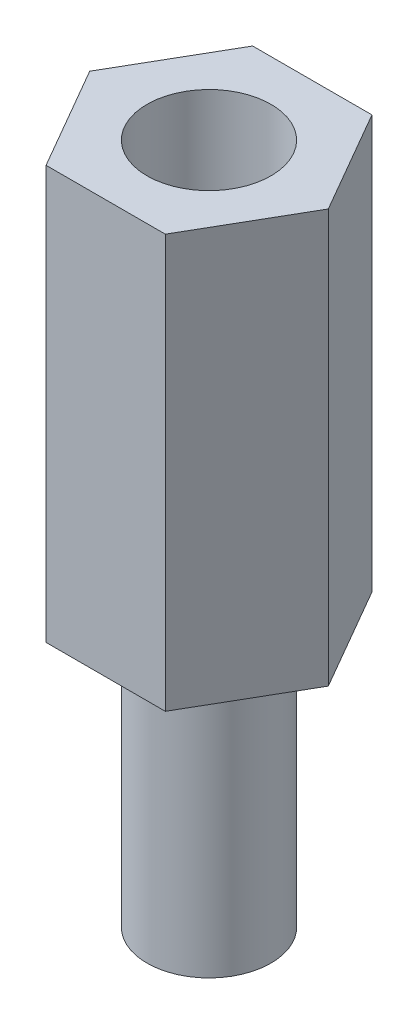
ISO-10303-21;
HEADER;
FILE_DESCRIPTION(('STEP AP214'),'2;1');
FILE_NAME('part.step','',(''),(''),'','','');
FILE_SCHEMA(('AUTOMOTIVE_DESIGN { 1 0 10303 214 1 1 1 1 }'));
ENDSEC;
DATA;
#1=APPLICATION_CONTEXT('core data for automotive mechanical design processes');
#2=APPLICATION_PROTOCOL_DEFINITION('international standard','automotive_design',2000,#1);
#3=PRODUCT_CONTEXT('',#1,'mechanical');
#4=PRODUCT('Part','Part','',(#3));
#5=PRODUCT_RELATED_PRODUCT_CATEGORY('part','',(#4));
#6=PRODUCT_DEFINITION_FORMATION('','',#4);
#7=PRODUCT_DEFINITION_CONTEXT('part definition',#1,'design');
#8=PRODUCT_DEFINITION('design','',#6,#7);
#9=PRODUCT_DEFINITION_SHAPE('','',#8);
#10=(LENGTH_UNIT() NAMED_UNIT(*) SI_UNIT(.MILLI.,.METRE.));
#11=(NAMED_UNIT(*) PLANE_ANGLE_UNIT() SI_UNIT($,.RADIAN.));
#12=(NAMED_UNIT(*) SI_UNIT($,.STERADIAN.) SOLID_ANGLE_UNIT());
#13=UNCERTAINTY_MEASURE_WITH_UNIT(LENGTH_MEASURE(1.E-05),#10,'distance_accuracy_value','');
#14=(GEOMETRIC_REPRESENTATION_CONTEXT(3) GLOBAL_UNCERTAINTY_ASSIGNED_CONTEXT((#13)) GLOBAL_UNIT_ASSIGNED_CONTEXT((#10,
#11,#12)) REPRESENTATION_CONTEXT('',''));
#15=CARTESIAN_POINT('',(0.,0.,0.));
#16=DIRECTION('',(0.,0.,1.));
#17=DIRECTION('',(1.,0.,0.));
#18=AXIS2_PLACEMENT_3D('',#15,#16,#17);
#19=CARTESIAN_POINT('',(0.,6.5,0.));
#20=DIRECTION('',(0.,-1.,0.));
#21=DIRECTION('',(0.,0.,-1.));
#22=AXIS2_PLACEMENT_3D('',#19,#20,#21);
#23=CYLINDRICAL_SURFACE('',#22,1.5);
#24=CARTESIAN_POINT('',(0.,6.5,0.));
#25=DIRECTION('',(0.,1.,0.));
#26=DIRECTION('',(0.,0.,1.));
#27=AXIS2_PLACEMENT_3D('',#24,#25,#26);
#28=CIRCLE('',#27,1.5);
#29=CARTESIAN_POINT('',(0.,6.5,-1.5));
#30=VERTEX_POINT('',#29);
#31=EDGE_CURVE('E11',#30,#30,#28,.T.);
#32=CARTESIAN_POINT('',(0.,0.,0.));
#33=DIRECTION('',(0.,1.,0.));
#34=DIRECTION('',(0.,0.,1.));
#35=AXIS2_PLACEMENT_3D('',#32,#33,#34);
#36=CIRCLE('',#35,1.5);
#37=CARTESIAN_POINT('',(0.,0.,-1.5));
#38=VERTEX_POINT('',#37);
#39=EDGE_CURVE('E37',#38,#38,#36,.T.);
#40=CARTESIAN_POINT('',(0.,6.5,-1.5));
#41=CARTESIAN_POINT('',(0.,6.43229166666667,-1.5));
#42=CARTESIAN_POINT('',(0.,6.36458333333333,-1.5));
#43=CARTESIAN_POINT('',(0.,6.22916666666667,-1.5));
#44=CARTESIAN_POINT('',(0.,6.16145833333333,-1.5));
#45=CARTESIAN_POINT('',(0.,6.02604166666667,-1.5));
#46=CARTESIAN_POINT('',(0.,5.95833333333333,-1.5));
#47=CARTESIAN_POINT('',(0.,5.82291666666667,-1.5));
#48=CARTESIAN_POINT('',(0.,5.75520833333333,-1.5));
#49=CARTESIAN_POINT('',(0.,5.61979166666667,-1.5));
#50=CARTESIAN_POINT('',(0.,5.55208333333333,-1.5));
#51=CARTESIAN_POINT('',(0.,5.41666666666667,-1.5));
#52=CARTESIAN_POINT('',(0.,5.34895833333333,-1.5));
#53=CARTESIAN_POINT('',(0.,5.21354166666667,-1.5));
#54=CARTESIAN_POINT('',(0.,5.14583333333333,-1.5));
#55=CARTESIAN_POINT('',(0.,5.01041666666667,-1.5));
#56=CARTESIAN_POINT('',(0.,4.94270833333333,-1.5));
#57=CARTESIAN_POINT('',(0.,4.80729166666667,-1.5));
#58=CARTESIAN_POINT('',(0.,4.73958333333333,-1.5));
#59=CARTESIAN_POINT('',(0.,4.60416666666667,-1.5));
#60=CARTESIAN_POINT('',(0.,4.53645833333333,-1.5));
#61=CARTESIAN_POINT('',(0.,4.40104166666667,-1.5));
#62=CARTESIAN_POINT('',(0.,4.33333333333333,-1.5));
#63=CARTESIAN_POINT('',(0.,4.19791666666667,-1.5));
#64=CARTESIAN_POINT('',(0.,4.13020833333333,-1.5));
#65=CARTESIAN_POINT('',(0.,3.99479166666667,-1.5));
#66=CARTESIAN_POINT('',(0.,3.92708333333333,-1.5));
#67=CARTESIAN_POINT('',(0.,3.79166666666667,-1.5));
#68=CARTESIAN_POINT('',(0.,3.72395833333333,-1.5));
#69=CARTESIAN_POINT('',(0.,3.58854166666667,-1.5));
#70=CARTESIAN_POINT('',(0.,3.52083333333333,-1.5));
#71=CARTESIAN_POINT('',(0.,3.38541666666667,-1.5));
#72=CARTESIAN_POINT('',(0.,3.31770833333333,-1.5));
#73=CARTESIAN_POINT('',(0.,3.18229166666667,-1.5));
#74=CARTESIAN_POINT('',(0.,3.11458333333333,-1.5));
#75=CARTESIAN_POINT('',(0.,2.97916666666667,-1.5));
#76=CARTESIAN_POINT('',(0.,2.91145833333333,-1.5));
#77=CARTESIAN_POINT('',(0.,2.77604166666667,-1.5));
#78=CARTESIAN_POINT('',(0.,2.70833333333333,-1.5));
#79=CARTESIAN_POINT('',(0.,2.57291666666667,-1.5));
#80=CARTESIAN_POINT('',(0.,2.50520833333333,-1.5));
#81=CARTESIAN_POINT('',(0.,2.36979166666667,-1.5));
#82=CARTESIAN_POINT('',(0.,2.30208333333333,-1.5));
#83=CARTESIAN_POINT('',(0.,2.16666666666667,-1.5));
#84=CARTESIAN_POINT('',(0.,2.09895833333333,-1.5));
#85=CARTESIAN_POINT('',(0.,1.96354166666667,-1.5));
#86=CARTESIAN_POINT('',(0.,1.89583333333333,-1.5));
#87=CARTESIAN_POINT('',(0.,1.76041666666667,-1.5));
#88=CARTESIAN_POINT('',(0.,1.69270833333333,-1.5));
#89=CARTESIAN_POINT('',(0.,1.55729166666667,-1.5));
#90=CARTESIAN_POINT('',(0.,1.48958333333333,-1.5));
#91=CARTESIAN_POINT('',(0.,1.35416666666667,-1.5));
#92=CARTESIAN_POINT('',(0.,1.28645833333333,-1.5));
#93=CARTESIAN_POINT('',(0.,1.15104166666667,-1.5));
#94=CARTESIAN_POINT('',(0.,1.08333333333333,-1.5));
#95=CARTESIAN_POINT('',(0.,0.947916666666667,-1.5));
#96=CARTESIAN_POINT('',(0.,0.880208333333333,-1.5));
#97=CARTESIAN_POINT('',(0.,0.744791666666667,-1.5));
#98=CARTESIAN_POINT('',(0.,0.677083333333333,-1.5));
#99=CARTESIAN_POINT('',(0.,0.541666666666667,-1.5));
#100=CARTESIAN_POINT('',(0.,0.473958333333333,-1.5));
#101=CARTESIAN_POINT('',(0.,0.338541666666667,-1.5));
#102=CARTESIAN_POINT('',(0.,0.270833333333334,-1.5));
#103=CARTESIAN_POINT('',(0.,0.135416666666667,-1.5));
#104=CARTESIAN_POINT('',(0.,0.0677083333333334,-1.5));
#105=CARTESIAN_POINT('',(0.,0.,-1.5));
#106=B_SPLINE_CURVE_WITH_KNOTS('',3,(#40,#41,#42,#43,#44,#45,#46,#47,#48,#49,#50,#51,#52,#53,
#54,#55,#56,#57,#58,#59,#60,#61,#62,#63,#64,#65,#66,#67,#68,#69,#70,#71,#72,#73,#74,#75,#76,#77,
#78,#79,#80,#81,#82,#83,#84,#85,#86,#87,#88,#89,#90,#91,#92,#93,#94,#95,#96,#97,#98,#99,#100,
#101,#102,#103,#104,#105),.UNSPECIFIED.,.F.,.F.,(4,2,2,2,2,2,2,2,2,2,2,2,2,2,2,2,2,2,2,2,2,2,2,
2,2,2,2,2,2,2,2,2,4),(0.,0.203124999999999,0.40625,0.609375,0.812499999999999,1.015625,1.21875,
1.421875,1.625,1.828125,2.03125,2.234375,2.4375,2.640625,2.84375,3.046875,3.25,3.453125,3.65625,
3.859375,4.0625,4.265625,4.46875,4.671875,4.875,5.078125,5.28125,5.484375,5.6875,5.890625,
6.09375,6.296875,6.5),.UNSPECIFIED.);
#107=EDGE_CURVE('BSEAM34',#30,#38,#106,.T.);
#108=ORIENTED_EDGE('',*,*,#31,.F.);
#109=ORIENTED_EDGE('',*,*,#39,.T.);
#110=ORIENTED_EDGE('',*,*,#107,.T.);
#111=ORIENTED_EDGE('',*,*,#107,.F.);
#112=EDGE_LOOP('',(#108,#110,#109,#111));
#113=FACE_BOUND('',#112,.T.);
#114=ADVANCED_FACE('F34',(#113),#23,.T.);
#115=CARTESIAN_POINT('',(0.,0.,0.));
#116=DIRECTION('',(0.,1.,0.));
#117=DIRECTION('',(0.,0.,1.));
#118=AXIS2_PLACEMENT_3D('',#115,#116,#117);
#119=PLANE('',#118);
#120=ORIENTED_EDGE('',*,*,#39,.F.);
#121=EDGE_LOOP('',(#120));
#122=FACE_BOUND('',#121,.T.);
#123=ADVANCED_FACE('F143',(#122),#119,.F.);
#124=CARTESIAN_POINT('',(-1.44337567297406,16.5,2.5));
#125=DIRECTION('',(0.,0.,-1.));
#126=DIRECTION('',(-1.,0.,0.));
#127=AXIS2_PLACEMENT_3D('',#124,#125,#126);
#128=PLANE('',#127);
#129=DIRECTION('',(1.,0.,0.));
#130=VECTOR('',#129,1.);
#131=CARTESIAN_POINT('',(-1.44337567297406,6.5,2.5));
#132=LINE('',#131,#130);
#133=CARTESIAN_POINT('',(-1.44337567297406,6.5,2.5));
#134=VERTEX_POINT('',#133);
#135=CARTESIAN_POINT('',(1.44337567297406,6.5,2.5));
#136=VERTEX_POINT('',#135);
#137=EDGE_CURVE('E119',#134,#136,#132,.T.);
#138=ORIENTED_EDGE('',*,*,#137,.T.);
#139=DIRECTION('',(0.,-1.,0.));
#140=VECTOR('',#139,1.);
#141=CARTESIAN_POINT('',(1.44337567297406,16.5,2.5));
#142=LINE('',#141,#140);
#143=CARTESIAN_POINT('',(1.44337567297406,16.5,2.5));
#144=VERTEX_POINT('',#143);
#145=EDGE_CURVE('E137',#144,#136,#142,.T.);
#146=ORIENTED_EDGE('',*,*,#145,.F.);
#147=DIRECTION('',(1.,0.,0.));
#148=VECTOR('',#147,1.);
#149=CARTESIAN_POINT('',(-1.44337567297406,16.5,2.5));
#150=LINE('',#149,#148);
#151=CARTESIAN_POINT('',(-1.44337567297406,16.5,2.5));
#152=VERTEX_POINT('',#151);
#153=EDGE_CURVE('E130',#152,#144,#150,.T.);
#154=ORIENTED_EDGE('',*,*,#153,.F.);
#155=DIRECTION('',(0.,-1.,0.));
#156=VECTOR('',#155,1.);
#157=CARTESIAN_POINT('',(-1.44337567297406,16.5,2.5));
#158=LINE('',#157,#156);
#159=EDGE_CURVE('E115',#152,#134,#158,.T.);
#160=ORIENTED_EDGE('',*,*,#159,.T.);
#161=EDGE_LOOP('',(#138,#146,#154,#160));
#162=FACE_BOUND('',#161,.T.);
#163=ADVANCED_FACE('F145',(#162),#128,.F.);
#164=CARTESIAN_POINT('',(1.44337567297406,16.5,2.5));
#165=DIRECTION('',(-0.866025403784439,0.,-0.5));
#166=DIRECTION('',(-0.5,0.,0.866025403784439));
#167=AXIS2_PLACEMENT_3D('',#164,#165,#166);
#168=PLANE('',#167);
#169=DIRECTION('',(0.5,0.,-0.866025403784439));
#170=VECTOR('',#169,1.);
#171=CARTESIAN_POINT('',(1.44337567297406,6.5,2.5));
#172=LINE('',#171,#170);
#173=CARTESIAN_POINT('',(2.88675134594813,6.5,0.));
#174=VERTEX_POINT('',#173);
#175=EDGE_CURVE('E122',#136,#174,#172,.T.);
#176=ORIENTED_EDGE('',*,*,#175,.T.);
#177=DIRECTION('',(0.,-1.,0.));
#178=VECTOR('',#177,1.);
#179=CARTESIAN_POINT('',(2.88675134594813,16.5,0.));
#180=LINE('',#179,#178);
#181=CARTESIAN_POINT('',(2.88675134594813,16.5,0.));
#182=VERTEX_POINT('',#181);
#183=EDGE_CURVE('E134',#182,#174,#180,.T.);
#184=ORIENTED_EDGE('',*,*,#183,.F.);
#185=DIRECTION('',(0.5,0.,-0.866025403784439));
#186=VECTOR('',#185,1.);
#187=CARTESIAN_POINT('',(1.44337567297406,16.5,2.5));
#188=LINE('',#187,#186);
#189=EDGE_CURVE('E88',#144,#182,#188,.T.);
#190=ORIENTED_EDGE('',*,*,#189,.F.);
#191=ORIENTED_EDGE('',*,*,#145,.T.);
#192=EDGE_LOOP('',(#176,#184,#190,#191));
#193=FACE_BOUND('',#192,.T.);
#194=ADVANCED_FACE('F150',(#193),#168,.F.);
#195=CARTESIAN_POINT('',(2.88675134594813,16.5,0.));
#196=DIRECTION('',(-0.866025403784438,0.,0.5));
#197=DIRECTION('',(0.5,0.,0.866025403784438));
#198=AXIS2_PLACEMENT_3D('',#195,#196,#197);
#199=PLANE('',#198);
#200=DIRECTION('',(-0.5,0.,-0.866025403784438));
#201=VECTOR('',#200,1.);
#202=CARTESIAN_POINT('',(2.88675134594813,6.5,0.));
#203=LINE('',#202,#201);
#204=CARTESIAN_POINT('',(1.44337567297406,6.5,-2.5));
#205=VERTEX_POINT('',#204);
#206=EDGE_CURVE('E125',#174,#205,#203,.T.);
#207=ORIENTED_EDGE('',*,*,#206,.T.);
#208=DIRECTION('',(0.,-1.,0.));
#209=VECTOR('',#208,1.);
#210=CARTESIAN_POINT('',(1.44337567297406,16.5,-2.5));
#211=LINE('',#210,#209);
#212=CARTESIAN_POINT('',(1.44337567297406,16.5,-2.5));
#213=VERTEX_POINT('',#212);
#214=EDGE_CURVE('E110',#213,#205,#211,.T.);
#215=ORIENTED_EDGE('',*,*,#214,.F.);
#216=DIRECTION('',(-0.5,0.,-0.866025403784438));
#217=VECTOR('',#216,1.);
#218=CARTESIAN_POINT('',(2.88675134594813,16.5,0.));
#219=LINE('',#218,#217);
#220=EDGE_CURVE('E101',#182,#213,#219,.T.);
#221=ORIENTED_EDGE('',*,*,#220,.F.);
#222=ORIENTED_EDGE('',*,*,#183,.T.);
#223=EDGE_LOOP('',(#207,#215,#221,#222));
#224=FACE_BOUND('',#223,.T.);
#225=ADVANCED_FACE('F157',(#224),#199,.F.);
#226=CARTESIAN_POINT('',(1.44337567297406,16.5,-2.5));
#227=DIRECTION('',(0.,0.,1.));
#228=DIRECTION('',(1.,0.,0.));
#229=AXIS2_PLACEMENT_3D('',#226,#227,#228);
#230=PLANE('',#229);
#231=DIRECTION('',(-1.,0.,0.));
#232=VECTOR('',#231,1.);
#233=CARTESIAN_POINT('',(1.44337567297406,6.5,-2.5));
#234=LINE('',#233,#232);
#235=CARTESIAN_POINT('',(-1.44337567297406,6.5,-2.5));
#236=VERTEX_POINT('',#235);
#237=EDGE_CURVE('E109',#205,#236,#234,.T.);
#238=ORIENTED_EDGE('',*,*,#237,.T.);
#239=DIRECTION('',(0.,-1.,0.));
#240=VECTOR('',#239,1.);
#241=CARTESIAN_POINT('',(-1.44337567297406,16.5,-2.5));
#242=LINE('',#241,#240);
#243=CARTESIAN_POINT('',(-1.44337567297406,16.5,-2.5));
#244=VERTEX_POINT('',#243);
#245=EDGE_CURVE('E106',#244,#236,#242,.T.);
#246=ORIENTED_EDGE('',*,*,#245,.F.);
#247=DIRECTION('',(-1.,0.,0.));
#248=VECTOR('',#247,1.);
#249=CARTESIAN_POINT('',(1.44337567297406,16.5,-2.5));
#250=LINE('',#249,#248);
#251=EDGE_CURVE('E95',#213,#244,#250,.T.);
#252=ORIENTED_EDGE('',*,*,#251,.F.);
#253=ORIENTED_EDGE('',*,*,#214,.T.);
#254=EDGE_LOOP('',(#238,#246,#252,#253));
#255=FACE_BOUND('',#254,.T.);
#256=ADVANCED_FACE('F107',(#255),#230,.F.);
#257=CARTESIAN_POINT('',(-1.44337567297406,16.5,-2.5));
#258=DIRECTION('',(0.866025403784439,0.,0.5));
#259=DIRECTION('',(0.5,0.,-0.866025403784439));
#260=AXIS2_PLACEMENT_3D('',#257,#258,#259);
#261=PLANE('',#260);
#262=DIRECTION('',(-0.5,0.,0.866025403784439));
#263=VECTOR('',#262,1.);
#264=CARTESIAN_POINT('',(-1.44337567297406,6.5,-2.5));
#265=LINE('',#264,#263);
#266=CARTESIAN_POINT('',(-2.88675134594813,6.5,0.));
#267=VERTEX_POINT('',#266);
#268=EDGE_CURVE('E73',#236,#267,#265,.T.);
#269=ORIENTED_EDGE('',*,*,#268,.T.);
#270=DIRECTION('',(0.,-1.,0.));
#271=VECTOR('',#270,1.);
#272=CARTESIAN_POINT('',(-2.88675134594813,16.5,0.));
#273=LINE('',#272,#271);
#274=CARTESIAN_POINT('',(-2.88675134594813,16.5,0.));
#275=VERTEX_POINT('',#274);
#276=EDGE_CURVE('E111',#275,#267,#273,.T.);
#277=ORIENTED_EDGE('',*,*,#276,.F.);
#278=DIRECTION('',(-0.5,0.,0.866025403784439));
#279=VECTOR('',#278,1.);
#280=CARTESIAN_POINT('',(-1.44337567297406,16.5,-2.5));
#281=LINE('',#280,#279);
#282=EDGE_CURVE('E99',#244,#275,#281,.T.);
#283=ORIENTED_EDGE('',*,*,#282,.F.);
#284=ORIENTED_EDGE('',*,*,#245,.T.);
#285=EDGE_LOOP('',(#269,#277,#283,#284));
#286=FACE_BOUND('',#285,.T.);
#287=ADVANCED_FACE('F113',(#286),#261,.F.);
#288=CARTESIAN_POINT('',(-2.88675134594813,16.5,0.));
#289=DIRECTION('',(0.866025403784439,0.,-0.5));
#290=DIRECTION('',(-0.5,0.,-0.866025403784439));
#291=AXIS2_PLACEMENT_3D('',#288,#289,#290);
#292=PLANE('',#291);
#293=DIRECTION('',(0.5,0.,0.866025403784439));
#294=VECTOR('',#293,1.);
#295=CARTESIAN_POINT('',(-2.88675134594813,6.5,0.));
#296=LINE('',#295,#294);
#297=EDGE_CURVE('E79',#267,#134,#296,.T.);
#298=ORIENTED_EDGE('',*,*,#297,.T.);
#299=ORIENTED_EDGE('',*,*,#159,.F.);
#300=DIRECTION('',(0.5,0.,0.866025403784439));
#301=VECTOR('',#300,1.);
#302=CARTESIAN_POINT('',(-2.88675134594813,16.5,0.));
#303=LINE('',#302,#301);
#304=EDGE_CURVE('E50',#275,#152,#303,.T.);
#305=ORIENTED_EDGE('',*,*,#304,.F.);
#306=ORIENTED_EDGE('',*,*,#276,.T.);
#307=EDGE_LOOP('',(#298,#299,#305,#306));
#308=FACE_BOUND('',#307,.T.);
#309=ADVANCED_FACE('F165',(#308),#292,.F.);
#310=CARTESIAN_POINT('',(0.,16.5,0.));
#311=DIRECTION('',(0.,1.,0.));
#312=DIRECTION('',(0.,0.,1.));
#313=AXIS2_PLACEMENT_3D('',#310,#311,#312);
#314=PLANE('',#313);
#315=CARTESIAN_POINT('',(0.,16.5,0.));
#316=DIRECTION('',(0.,1.,0.));
#317=DIRECTION('',(0.,0.,1.));
#318=AXIS2_PLACEMENT_3D('',#315,#316,#317);
#319=CIRCLE('',#318,1.5);
#320=CARTESIAN_POINT('',(0.,16.5,1.5));
#321=VERTEX_POINT('',#320);
#322=EDGE_CURVE('E186',#321,#321,#319,.T.);
#323=ORIENTED_EDGE('',*,*,#322,.F.);
#324=EDGE_LOOP('',(#323));
#325=FACE_BOUND('',#324,.T.);
#326=ORIENTED_EDGE('',*,*,#153,.T.);
#327=ORIENTED_EDGE('',*,*,#189,.T.);
#328=ORIENTED_EDGE('',*,*,#220,.T.);
#329=ORIENTED_EDGE('',*,*,#251,.T.);
#330=ORIENTED_EDGE('',*,*,#282,.T.);
#331=ORIENTED_EDGE('',*,*,#304,.T.);
#332=EDGE_LOOP('',(#326,#327,#328,#329,#330,#331));
#333=FACE_BOUND('',#332,.T.);
#334=ADVANCED_FACE('F97',(#325,#333),#314,.T.);
#335=CARTESIAN_POINT('',(0.,6.5,0.));
#336=DIRECTION('',(0.,1.,0.));
#337=DIRECTION('',(0.,0.,1.));
#338=AXIS2_PLACEMENT_3D('',#335,#336,#337);
#339=PLANE('',#338);
#340=ORIENTED_EDGE('',*,*,#31,.T.);
#341=EDGE_LOOP('',(#340));
#342=FACE_BOUND('',#341,.T.);
#343=ORIENTED_EDGE('',*,*,#137,.F.);
#344=ORIENTED_EDGE('',*,*,#297,.F.);
#345=ORIENTED_EDGE('',*,*,#268,.F.);
#346=ORIENTED_EDGE('',*,*,#237,.F.);
#347=ORIENTED_EDGE('',*,*,#206,.F.);
#348=ORIENTED_EDGE('',*,*,#175,.F.);
#349=EDGE_LOOP('',(#343,#344,#345,#346,#347,#348));
#350=FACE_BOUND('',#349,.T.);
#351=ADVANCED_FACE('F168',(#342,#350),#339,.F.);
#352=CARTESIAN_POINT('',(0.,10.,0.));
#353=DIRECTION('',(0.,1.,0.));
#354=DIRECTION('',(0.,0.,1.));
#355=AXIS2_PLACEMENT_3D('',#352,#353,#354);
#356=CYLINDRICAL_SURFACE('',#355,1.5);
#357=CARTESIAN_POINT('',(0.,10.,0.));
#358=DIRECTION('',(0.,1.,0.));
#359=DIRECTION('',(0.,0.,1.));
#360=AXIS2_PLACEMENT_3D('',#357,#358,#359);
#361=CIRCLE('',#360,1.5);
#362=CARTESIAN_POINT('',(0.,10.,1.5));
#363=VERTEX_POINT('',#362);
#364=EDGE_CURVE('E123',#363,#363,#361,.T.);
#365=CARTESIAN_POINT('',(0.,10.,1.5));
#366=CARTESIAN_POINT('',(0.,10.0677083333333,1.5));
#367=CARTESIAN_POINT('',(0.,10.1354166666667,1.5));
#368=CARTESIAN_POINT('',(0.,10.2708333333333,1.5));
#369=CARTESIAN_POINT('',(0.,10.3385416666667,1.5));
#370=CARTESIAN_POINT('',(0.,10.4739583333333,1.5));
#371=CARTESIAN_POINT('',(0.,10.5416666666667,1.5));
#372=CARTESIAN_POINT('',(0.,10.6770833333333,1.5));
#373=CARTESIAN_POINT('',(0.,10.7447916666667,1.5));
#374=CARTESIAN_POINT('',(0.,10.8802083333333,1.5));
#375=CARTESIAN_POINT('',(0.,10.9479166666667,1.5));
#376=CARTESIAN_POINT('',(0.,11.0833333333333,1.5));
#377=CARTESIAN_POINT('',(0.,11.1510416666667,1.5));
#378=CARTESIAN_POINT('',(0.,11.2864583333333,1.5));
#379=CARTESIAN_POINT('',(0.,11.3541666666667,1.5));
#380=CARTESIAN_POINT('',(0.,11.4895833333333,1.5));
#381=CARTESIAN_POINT('',(0.,11.5572916666667,1.5));
#382=CARTESIAN_POINT('',(0.,11.6927083333333,1.5));
#383=CARTESIAN_POINT('',(0.,11.7604166666667,1.5));
#384=CARTESIAN_POINT('',(0.,11.8958333333333,1.5));
#385=CARTESIAN_POINT('',(0.,11.9635416666667,1.5));
#386=CARTESIAN_POINT('',(0.,12.0989583333333,1.5));
#387=CARTESIAN_POINT('',(0.,12.1666666666667,1.5));
#388=CARTESIAN_POINT('',(0.,12.3020833333333,1.5));
#389=CARTESIAN_POINT('',(0.,12.3697916666667,1.5));
#390=CARTESIAN_POINT('',(0.,12.5052083333333,1.5));
#391=CARTESIAN_POINT('',(0.,12.5729166666667,1.5));
#392=CARTESIAN_POINT('',(0.,12.7083333333333,1.5));
#393=CARTESIAN_POINT('',(0.,12.7760416666667,1.5));
#394=CARTESIAN_POINT('',(0.,12.9114583333333,1.5));
#395=CARTESIAN_POINT('',(0.,12.9791666666667,1.5));
#396=CARTESIAN_POINT('',(0.,13.1145833333333,1.5));
#397=CARTESIAN_POINT('',(0.,13.1822916666667,1.5));
#398=CARTESIAN_POINT('',(0.,13.3177083333333,1.5));
#399=CARTESIAN_POINT('',(0.,13.3854166666667,1.5));
#400=CARTESIAN_POINT('',(0.,13.5208333333333,1.5));
#401=CARTESIAN_POINT('',(0.,13.5885416666667,1.5));
#402=CARTESIAN_POINT('',(0.,13.7239583333333,1.5));
#403=CARTESIAN_POINT('',(0.,13.7916666666667,1.5));
#404=CARTESIAN_POINT('',(0.,13.9270833333333,1.5));
#405=CARTESIAN_POINT('',(0.,13.9947916666667,1.5));
#406=CARTESIAN_POINT('',(0.,14.1302083333333,1.5));
#407=CARTESIAN_POINT('',(0.,14.1979166666667,1.5));
#408=CARTESIAN_POINT('',(0.,14.3333333333333,1.5));
#409=CARTESIAN_POINT('',(0.,14.4010416666667,1.5));
#410=CARTESIAN_POINT('',(0.,14.5364583333333,1.5));
#411=CARTESIAN_POINT('',(0.,14.6041666666667,1.5));
#412=CARTESIAN_POINT('',(0.,14.7395833333333,1.5));
#413=CARTESIAN_POINT('',(0.,14.8072916666667,1.5));
#414=CARTESIAN_POINT('',(0.,14.9427083333333,1.5));
#415=CARTESIAN_POINT('',(0.,15.0104166666667,1.5));
#416=CARTESIAN_POINT('',(0.,15.1458333333333,1.5));
#417=CARTESIAN_POINT('',(0.,15.2135416666667,1.5));
#418=CARTESIAN_POINT('',(0.,15.3489583333333,1.5));
#419=CARTESIAN_POINT('',(0.,15.4166666666667,1.5));
#420=CARTESIAN_POINT('',(0.,15.5520833333333,1.5));
#421=CARTESIAN_POINT('',(0.,15.6197916666667,1.5));
#422=CARTESIAN_POINT('',(0.,15.7552083333333,1.5));
#423=CARTESIAN_POINT('',(0.,15.8229166666667,1.5));
#424=CARTESIAN_POINT('',(0.,15.9583333333333,1.5));
#425=CARTESIAN_POINT('',(0.,16.0260416666667,1.5));
#426=CARTESIAN_POINT('',(0.,16.1614583333333,1.5));
#427=CARTESIAN_POINT('',(0.,16.2291666666667,1.5));
#428=CARTESIAN_POINT('',(0.,16.3645833333333,1.5));
#429=CARTESIAN_POINT('',(0.,16.4322916666667,1.5));
#430=CARTESIAN_POINT('',(0.,16.5,1.5));
#431=B_SPLINE_CURVE_WITH_KNOTS('',3,(#365,#366,#367,#368,#369,#370,#371,#372,#373,#374,#375,
#376,#377,#378,#379,#380,#381,#382,#383,#384,#385,#386,#387,#388,#389,#390,#391,#392,#393,#394,
#395,#396,#397,#398,#399,#400,#401,#402,#403,#404,#405,#406,#407,#408,#409,#410,#411,#412,#413,
#414,#415,#416,#417,#418,#419,#420,#421,#422,#423,#424,#425,#426,#427,#428,#429,#430),
.UNSPECIFIED.,.F.,.F.,(4,2,2,2,2,2,2,2,2,2,2,2,2,2,2,2,2,2,2,2,2,2,2,2,2,2,2,2,2,2,2,2,4),(0.,
0.203124999999998,0.406249999999999,0.609374999999999,0.812499999999999,1.015625,1.21875,
1.421875,1.625,1.828125,2.03125,2.234375,2.4375,2.640625,2.84375,3.046875,3.25,3.453125,3.65625,
3.859375,4.0625,4.265625,4.46875,4.671875,4.875,5.078125,5.28125,5.484375,5.6875,5.890625,
6.09374999999999,6.296875,6.5),.UNSPECIFIED.);
#432=EDGE_CURVE('BSEAM171',#363,#321,#431,.T.);
#433=ORIENTED_EDGE('',*,*,#364,.F.);
#434=ORIENTED_EDGE('',*,*,#322,.T.);
#435=ORIENTED_EDGE('',*,*,#432,.T.);
#436=ORIENTED_EDGE('',*,*,#432,.F.);
#437=EDGE_LOOP('',(#433,#435,#434,#436));
#438=FACE_BOUND('',#437,.T.);
#439=ADVANCED_FACE('F171',(#438),#356,.F.);
#440=CARTESIAN_POINT('',(0.,10.,0.));
#441=DIRECTION('',(0.,1.,0.));
#442=DIRECTION('',(0.,0.,1.));
#443=AXIS2_PLACEMENT_3D('',#440,#441,#442);
#444=PLANE('',#443);
#445=ORIENTED_EDGE('',*,*,#364,.T.);
#446=EDGE_LOOP('',(#445));
#447=FACE_BOUND('',#446,.T.);
#448=ADVANCED_FACE('F178',(#447),#444,.T.);
#449=CLOSED_SHELL('',(#114,#123,#163,#194,#225,#256,#287,#309,#334,#351,#439,#448));
#450=MANIFOLD_SOLID_BREP('B2',#449);
#451=ADVANCED_BREP_SHAPE_REPRESENTATION('',(#18,#450),#14);
#452=SHAPE_DEFINITION_REPRESENTATION(#9,#451);
ENDSEC;
END-ISO-10303-21;
